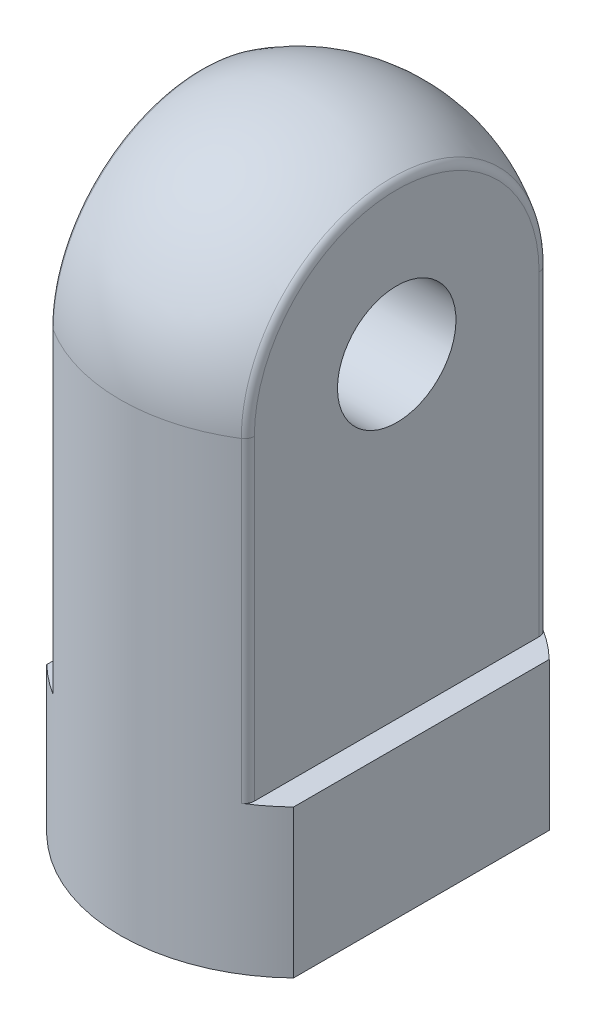
ISO-10303-21;
HEADER;
FILE_DESCRIPTION(('STEP AP214'),'2;1');
FILE_NAME('part.step','',(''),(''),'','','');
FILE_SCHEMA(('AUTOMOTIVE_DESIGN { 1 0 10303 214 1 1 1 1 }'));
ENDSEC;
DATA;
#1=APPLICATION_CONTEXT('core data for automotive mechanical design processes');
#2=APPLICATION_PROTOCOL_DEFINITION('international standard','automotive_design',2000,#1);
#3=PRODUCT_CONTEXT('',#1,'mechanical');
#4=PRODUCT('Part','Part','',(#3));
#5=PRODUCT_RELATED_PRODUCT_CATEGORY('part','',(#4));
#6=PRODUCT_DEFINITION_FORMATION('','',#4);
#7=PRODUCT_DEFINITION_CONTEXT('part definition',#1,'design');
#8=PRODUCT_DEFINITION('design','',#6,#7);
#9=PRODUCT_DEFINITION_SHAPE('','',#8);
#10=(LENGTH_UNIT() NAMED_UNIT(*) SI_UNIT(.MILLI.,.METRE.));
#11=(NAMED_UNIT(*) PLANE_ANGLE_UNIT() SI_UNIT($,.RADIAN.));
#12=(NAMED_UNIT(*) SI_UNIT($,.STERADIAN.) SOLID_ANGLE_UNIT());
#13=UNCERTAINTY_MEASURE_WITH_UNIT(LENGTH_MEASURE(1.E-05),#10,'distance_accuracy_value','');
#14=(GEOMETRIC_REPRESENTATION_CONTEXT(3) GLOBAL_UNCERTAINTY_ASSIGNED_CONTEXT((#13)) GLOBAL_UNIT_ASSIGNED_CONTEXT((#10,
#11,#12)) REPRESENTATION_CONTEXT('',''));
#15=CARTESIAN_POINT('',(0.,0.,0.));
#16=DIRECTION('',(0.,0.,1.));
#17=DIRECTION('',(1.,0.,0.));
#18=AXIS2_PLACEMENT_3D('',#15,#16,#17);
#19=CARTESIAN_POINT('',(0.,65.,0.));
#20=DIRECTION('',(0.,-1.,0.));
#21=DIRECTION('',(0.,0.,-1.));
#22=AXIS2_PLACEMENT_3D('',#19,#20,#21);
#23=CYLINDRICAL_SURFACE('',#22,18.);
#24=CARTESIAN_POINT('',(0.,47.,0.));
#25=DIRECTION('',(0.,-1.,0.));
#26=DIRECTION('',(0.,0.,-1.));
#27=AXIS2_PLACEMENT_3D('',#24,#25,#26);
#28=CIRCLE('',#27,18.);
#29=CARTESIAN_POINT('',(-9.52941176470586,47.,-15.2705701078475));
#30=VERTEX_POINT('',#29);
#31=CARTESIAN_POINT('',(9.52941176470587,47.,-15.2705701078475));
#32=VERTEX_POINT('',#31);
#33=EDGE_CURVE('E179',#30,#32,#28,.T.);
#34=ORIENTED_EDGE('',*,*,#33,.T.);
#35=DIRECTION('',(0.,-1.,0.));
#36=VECTOR('',#35,1.);
#37=CARTESIAN_POINT('',(9.52941176470587,65.,-15.2705701078475));
#38=LINE('',#37,#36);
#39=CARTESIAN_POINT('',(9.52941176470587,15.,-15.2705701078475));
#40=VERTEX_POINT('',#39);
#41=EDGE_CURVE('E208',#32,#40,#38,.T.);
#42=ORIENTED_EDGE('',*,*,#41,.T.);
#43=CARTESIAN_POINT('',(0.,15.,0.));
#44=DIRECTION('',(0.,1.,0.));
#45=DIRECTION('',(-1.,0.,0.));
#46=AXIS2_PLACEMENT_3D('',#43,#44,#45);
#47=CIRCLE('',#46,18.);
#48=CARTESIAN_POINT('',(12.5,15.,-12.9518338469886));
#49=VERTEX_POINT('',#48);
#50=EDGE_CURVE('E188',#49,#40,#47,.T.);
#51=ORIENTED_EDGE('',*,*,#50,.F.);
#52=DIRECTION('',(0.,-1.,0.));
#53=VECTOR('',#52,1.);
#54=CARTESIAN_POINT('',(12.5,65.,-12.9518338469886));
#55=LINE('',#54,#53);
#56=CARTESIAN_POINT('',(12.5,0.,-12.9518338469886));
#57=VERTEX_POINT('',#56);
#58=EDGE_CURVE('E159',#57,#49,#55,.F.);
#59=ORIENTED_EDGE('',*,*,#58,.F.);
#60=CARTESIAN_POINT('',(0.,0.,0.));
#61=DIRECTION('',(0.,1.,0.));
#62=DIRECTION('',(0.,0.,1.));
#63=AXIS2_PLACEMENT_3D('',#60,#61,#62);
#64=CIRCLE('',#63,18.);
#65=CARTESIAN_POINT('',(-12.5,0.,-12.9518338469886));
#66=VERTEX_POINT('',#65);
#67=EDGE_CURVE('E175',#57,#66,#64,.T.);
#68=ORIENTED_EDGE('',*,*,#67,.T.);
#69=DIRECTION('',(0.,-1.,0.));
#70=VECTOR('',#69,1.);
#71=CARTESIAN_POINT('',(-12.5,65.,-12.9518338469886));
#72=LINE('',#71,#70);
#73=CARTESIAN_POINT('',(-12.5,15.,-12.9518338469886));
#74=VERTEX_POINT('',#73);
#75=EDGE_CURVE('E172',#74,#66,#72,.T.);
#76=ORIENTED_EDGE('',*,*,#75,.F.);
#77=CARTESIAN_POINT('',(0.,15.,0.));
#78=DIRECTION('',(0.,1.,0.));
#79=DIRECTION('',(0.,0.,1.));
#80=AXIS2_PLACEMENT_3D('',#77,#78,#79);
#81=CIRCLE('',#80,18.);
#82=CARTESIAN_POINT('',(-9.52941176470586,15.,-15.2705701078475));
#83=VERTEX_POINT('',#82);
#84=EDGE_CURVE('E193',#83,#74,#81,.T.);
#85=ORIENTED_EDGE('',*,*,#84,.F.);
#86=DIRECTION('',(0.,-1.,0.));
#87=VECTOR('',#86,1.);
#88=CARTESIAN_POINT('',(-9.52941176470586,65.,-15.2705701078475));
#89=LINE('',#88,#87);
#90=EDGE_CURVE('E206',#83,#30,#89,.F.);
#91=ORIENTED_EDGE('',*,*,#90,.T.);
#92=EDGE_LOOP('',(#34,#42,#51,#59,#68,#76,#85,#91));
#93=FACE_BOUND('',#92,.T.);
#94=ADVANCED_FACE('F41',(#93),#23,.T.);
#95=CARTESIAN_POINT('',(9.52941176470587,15.,15.2705701078475));
#96=VERTEX_POINT('',#95);
#97=CARTESIAN_POINT('',(12.5,15.,12.9518338469886));
#98=VERTEX_POINT('',#97);
#99=EDGE_CURVE('E190',#96,#98,#47,.T.);
#100=ORIENTED_EDGE('',*,*,#99,.F.);
#101=DIRECTION('',(0.,-1.,0.));
#102=VECTOR('',#101,1.);
#103=CARTESIAN_POINT('',(9.52941176470587,65.,15.2705701078475));
#104=LINE('',#103,#102);
#105=CARTESIAN_POINT('',(9.52941176470587,47.,15.2705701078475));
#106=VERTEX_POINT('',#105);
#107=EDGE_CURVE('E204',#96,#106,#104,.F.);
#108=ORIENTED_EDGE('',*,*,#107,.T.);
#109=CARTESIAN_POINT('',(-9.52941176470586,47.,15.2705701078475));
#110=VERTEX_POINT('',#109);
#111=EDGE_CURVE('E182',#106,#110,#28,.T.);
#112=ORIENTED_EDGE('',*,*,#111,.T.);
#113=DIRECTION('',(0.,-1.,0.));
#114=VECTOR('',#113,1.);
#115=CARTESIAN_POINT('',(-9.52941176470586,65.,15.2705701078475));
#116=LINE('',#115,#114);
#117=CARTESIAN_POINT('',(-9.52941176470586,15.,15.2705701078475));
#118=VERTEX_POINT('',#117);
#119=EDGE_CURVE('E201',#110,#118,#116,.T.);
#120=ORIENTED_EDGE('',*,*,#119,.T.);
#121=CARTESIAN_POINT('',(-12.5,15.,12.9518338469886));
#122=VERTEX_POINT('',#121);
#123=EDGE_CURVE('E191',#122,#118,#81,.T.);
#124=ORIENTED_EDGE('',*,*,#123,.F.);
#125=DIRECTION('',(0.,-1.,0.));
#126=VECTOR('',#125,1.);
#127=CARTESIAN_POINT('',(-12.5,65.,12.9518338469886));
#128=LINE('',#127,#126);
#129=CARTESIAN_POINT('',(-12.5,0.,12.9518338469886));
#130=VERTEX_POINT('',#129);
#131=EDGE_CURVE('E170',#130,#122,#128,.F.);
#132=ORIENTED_EDGE('',*,*,#131,.F.);
#133=CARTESIAN_POINT('',(12.5,0.,12.9518338469886));
#134=VERTEX_POINT('',#133);
#135=EDGE_CURVE('E176',#130,#134,#64,.T.);
#136=ORIENTED_EDGE('',*,*,#135,.T.);
#137=DIRECTION('',(0.,-1.,0.));
#138=VECTOR('',#137,1.);
#139=CARTESIAN_POINT('',(12.5,65.,12.9518338469886));
#140=LINE('',#139,#138);
#141=EDGE_CURVE('E168',#98,#134,#140,.T.);
#142=ORIENTED_EDGE('',*,*,#141,.F.);
#143=EDGE_LOOP('',(#100,#108,#112,#120,#124,#132,#136,#142));
#144=FACE_BOUND('',#143,.T.);
#145=ADVANCED_FACE('F245',(#144),#23,.T.);
#146=CARTESIAN_POINT('',(0.,0.,0.));
#147=DIRECTION('',(0.,1.,0.));
#148=DIRECTION('',(0.,0.,1.));
#149=AXIS2_PLACEMENT_3D('',#146,#147,#148);
#150=PLANE('',#149);
#151=CARTESIAN_POINT('',(0.,0.,0.));
#152=DIRECTION('',(0.,-1.,0.));
#153=DIRECTION('',(0.,0.,-1.));
#154=AXIS2_PLACEMENT_3D('',#151,#152,#153);
#155=CIRCLE('',#154,5.1);
#156=CARTESIAN_POINT('',(0.,0.,-5.1));
#157=VERTEX_POINT('',#156);
#158=EDGE_CURVE('E144',#157,#157,#155,.T.);
#159=ORIENTED_EDGE('',*,*,#158,.F.);
#160=EDGE_LOOP('',(#159));
#161=FACE_BOUND('',#160,.T.);
#162=DIRECTION('',(0.,0.,1.));
#163=VECTOR('',#162,1.);
#164=CARTESIAN_POINT('',(-12.5,0.,0.));
#165=LINE('',#164,#163);
#166=EDGE_CURVE('E185',#66,#130,#165,.T.);
#167=ORIENTED_EDGE('',*,*,#166,.F.);
#168=ORIENTED_EDGE('',*,*,#67,.F.);
#169=DIRECTION('',(0.,0.,-1.));
#170=VECTOR('',#169,1.);
#171=CARTESIAN_POINT('',(12.5,0.,0.));
#172=LINE('',#171,#170);
#173=EDGE_CURVE('E183',#134,#57,#172,.T.);
#174=ORIENTED_EDGE('',*,*,#173,.F.);
#175=ORIENTED_EDGE('',*,*,#135,.F.);
#176=EDGE_LOOP('',(#167,#168,#174,#175));
#177=FACE_BOUND('',#176,.T.);
#178=ADVANCED_FACE('F288',(#161,#177),#150,.F.);
#179=CARTESIAN_POINT('',(0.,47.,0.));
#180=DIRECTION('',(0.,0.,1.));
#181=DIRECTION('',(1.,0.,0.));
#182=AXIS2_PLACEMENT_3D('',#179,#180,#181);
#183=SPHERICAL_SURFACE('',#182,18.);
#184=ORIENTED_EDGE('',*,*,#111,.F.);
#185=CARTESIAN_POINT('',(9.52941176470587,47.,0.));
#186=DIRECTION('',(-1.,0.,0.));
#187=DIRECTION('',(0.,-1.,0.));
#188=AXIS2_PLACEMENT_3D('',#185,#186,#187);
#189=CIRCLE('',#188,15.2705701078475);
#190=EDGE_CURVE('E217',#106,#32,#189,.T.);
#191=ORIENTED_EDGE('',*,*,#190,.T.);
#192=ORIENTED_EDGE('',*,*,#33,.F.);
#193=CARTESIAN_POINT('',(-9.52941176470586,47.,0.));
#194=DIRECTION('',(1.,0.,0.));
#195=DIRECTION('',(0.,0.,-1.));
#196=AXIS2_PLACEMENT_3D('',#193,#194,#195);
#197=CIRCLE('',#196,15.2705701078475);
#198=EDGE_CURVE('E215',#30,#110,#197,.T.);
#199=ORIENTED_EDGE('',*,*,#198,.T.);
#200=EDGE_LOOP('',(#184,#191,#192,#199));
#201=FACE_BOUND('',#200,.T.);
#202=ADVANCED_FACE('F251',(#201),#183,.T.);
#203=CARTESIAN_POINT('',(12.5,0.,-18.));
#204=DIRECTION('',(1.,0.,0.));
#205=DIRECTION('',(0.,1.,0.));
#206=AXIS2_PLACEMENT_3D('',#203,#204,#205);
#207=PLANE('',#206);
#208=ORIENTED_EDGE('',*,*,#141,.T.);
#209=ORIENTED_EDGE('',*,*,#173,.T.);
#210=ORIENTED_EDGE('',*,*,#58,.T.);
#211=DIRECTION('',(0.,0.,1.));
#212=VECTOR('',#211,1.);
#213=CARTESIAN_POINT('',(12.5,15.,-18.));
#214=LINE('',#213,#212);
#215=EDGE_CURVE('E155',#49,#98,#214,.T.);
#216=ORIENTED_EDGE('',*,*,#215,.T.);
#217=EDGE_LOOP('',(#208,#209,#210,#216));
#218=FACE_BOUND('',#217,.T.);
#219=ADVANCED_FACE('F291',(#218),#207,.T.);
#220=CARTESIAN_POINT('',(10.,15.,-18.));
#221=DIRECTION('',(1.,0.,0.));
#222=DIRECTION('',(0.,1.,0.));
#223=AXIS2_PLACEMENT_3D('',#220,#221,#222);
#224=PLANE('',#223);
#225=CARTESIAN_POINT('',(9.99999999999999,47.,0.));
#226=DIRECTION('',(1.,0.,0.));
#227=DIRECTION('',(0.,1.,0.));
#228=AXIS2_PLACEMENT_3D('',#225,#226,#227);
#229=CIRCLE('',#228,6.);
#230=CARTESIAN_POINT('',(9.99999999999999,53.,0.));
#231=VERTEX_POINT('',#230);
#232=EDGE_CURVE('E147',#231,#231,#229,.T.);
#233=ORIENTED_EDGE('',*,*,#232,.F.);
#234=EDGE_LOOP('',(#233));
#235=FACE_BOUND('',#234,.T.);
#236=CARTESIAN_POINT('',(9.99999999999999,47.,0.));
#237=DIRECTION('',(1.,0.,0.));
#238=DIRECTION('',(0.,1.,0.));
#239=AXIS2_PLACEMENT_3D('',#236,#237,#238);
#240=CIRCLE('',#239,14.422205101856);
#241=CARTESIAN_POINT('',(9.99999999999999,47.,-14.422205101856));
#242=VERTEX_POINT('',#241);
#243=CARTESIAN_POINT('',(9.99999999999999,47.,14.422205101856));
#244=VERTEX_POINT('',#243);
#245=EDGE_CURVE('E194',#242,#244,#240,.T.);
#246=ORIENTED_EDGE('',*,*,#245,.T.);
#247=DIRECTION('',(0.,1.,0.));
#248=VECTOR('',#247,1.);
#249=CARTESIAN_POINT('',(10.,15.,14.422205101856));
#250=LINE('',#249,#248);
#251=CARTESIAN_POINT('',(10.,15.,14.422205101856));
#252=VERTEX_POINT('',#251);
#253=EDGE_CURVE('E198',#244,#252,#250,.F.);
#254=ORIENTED_EDGE('',*,*,#253,.T.);
#255=DIRECTION('',(0.,0.,1.));
#256=VECTOR('',#255,1.);
#257=CARTESIAN_POINT('',(10.,15.,-18.));
#258=LINE('',#257,#256);
#259=CARTESIAN_POINT('',(10.,15.,-14.422205101856));
#260=VERTEX_POINT('',#259);
#261=EDGE_CURVE('E162',#260,#252,#258,.T.);
#262=ORIENTED_EDGE('',*,*,#261,.F.);
#263=DIRECTION('',(0.,1.,0.));
#264=VECTOR('',#263,1.);
#265=CARTESIAN_POINT('',(9.99999999999999,47.,-14.422205101856));
#266=LINE('',#265,#264);
#267=EDGE_CURVE('E196',#260,#242,#266,.T.);
#268=ORIENTED_EDGE('',*,*,#267,.T.);
#269=EDGE_LOOP('',(#246,#254,#262,#268));
#270=FACE_BOUND('',#269,.T.);
#271=ADVANCED_FACE('F263',(#235,#270),#224,.T.);
#272=CARTESIAN_POINT('',(12.5,15.,-18.));
#273=DIRECTION('',(0.,1.,0.));
#274=DIRECTION('',(-1.,0.,0.));
#275=AXIS2_PLACEMENT_3D('',#272,#273,#274);
#276=PLANE('',#275);
#277=ORIENTED_EDGE('',*,*,#99,.T.);
#278=ORIENTED_EDGE('',*,*,#215,.F.);
#279=ORIENTED_EDGE('',*,*,#50,.T.);
#280=CARTESIAN_POINT('',(8.99999999999999,15.,-14.422205101856));
#281=DIRECTION('',(0.,1.,0.));
#282=DIRECTION('',(-1.,0.,0.));
#283=AXIS2_PLACEMENT_3D('',#280,#281,#282);
#284=CIRCLE('',#283,1.);
#285=EDGE_CURVE('E222',#40,#260,#284,.F.);
#286=ORIENTED_EDGE('',*,*,#285,.T.);
#287=ORIENTED_EDGE('',*,*,#261,.T.);
#288=CARTESIAN_POINT('',(8.99999999999999,15.,14.422205101856));
#289=DIRECTION('',(0.,1.,0.));
#290=DIRECTION('',(-1.,0.,0.));
#291=AXIS2_PLACEMENT_3D('',#288,#289,#290);
#292=CIRCLE('',#291,1.);
#293=EDGE_CURVE('E219',#252,#96,#292,.F.);
#294=ORIENTED_EDGE('',*,*,#293,.T.);
#295=EDGE_LOOP('',(#277,#278,#279,#286,#287,#294));
#296=FACE_BOUND('',#295,.T.);
#297=ADVANCED_FACE('F266',(#296),#276,.T.);
#298=CARTESIAN_POINT('',(-12.5,15.,-18.));
#299=DIRECTION('',(0.,1.,0.));
#300=DIRECTION('',(0.,0.,1.));
#301=AXIS2_PLACEMENT_3D('',#298,#299,#300);
#302=PLANE('',#301);
#303=ORIENTED_EDGE('',*,*,#84,.T.);
#304=DIRECTION('',(0.,0.,1.));
#305=VECTOR('',#304,1.);
#306=CARTESIAN_POINT('',(-12.5,15.,-18.));
#307=LINE('',#306,#305);
#308=EDGE_CURVE('E156',#74,#122,#307,.T.);
#309=ORIENTED_EDGE('',*,*,#308,.T.);
#310=ORIENTED_EDGE('',*,*,#123,.T.);
#311=CARTESIAN_POINT('',(-8.99999999999998,15.,14.422205101856));
#312=DIRECTION('',(0.,1.,0.));
#313=DIRECTION('',(0.,0.,1.));
#314=AXIS2_PLACEMENT_3D('',#311,#312,#313);
#315=CIRCLE('',#314,1.);
#316=CARTESIAN_POINT('',(-9.99999999999998,15.,14.422205101856));
#317=VERTEX_POINT('',#316);
#318=EDGE_CURVE('E12',#118,#317,#315,.F.);
#319=ORIENTED_EDGE('',*,*,#318,.T.);
#320=DIRECTION('',(0.,0.,1.));
#321=VECTOR('',#320,1.);
#322=CARTESIAN_POINT('',(-9.99999999999998,15.,-18.));
#323=LINE('',#322,#321);
#324=CARTESIAN_POINT('',(-9.99999999999998,15.,-14.422205101856));
#325=VERTEX_POINT('',#324);
#326=EDGE_CURVE('E160',#325,#317,#323,.T.);
#327=ORIENTED_EDGE('',*,*,#326,.F.);
#328=CARTESIAN_POINT('',(-8.99999999999998,15.,-14.422205101856));
#329=DIRECTION('',(0.,1.,0.));
#330=DIRECTION('',(0.,0.,1.));
#331=AXIS2_PLACEMENT_3D('',#328,#329,#330);
#332=CIRCLE('',#331,1.);
#333=EDGE_CURVE('E50',#325,#83,#332,.F.);
#334=ORIENTED_EDGE('',*,*,#333,.T.);
#335=EDGE_LOOP('',(#303,#309,#310,#319,#327,#334));
#336=FACE_BOUND('',#335,.T.);
#337=ADVANCED_FACE('F280',(#336),#302,.T.);
#338=CARTESIAN_POINT('',(-12.5,0.,-18.));
#339=DIRECTION('',(-1.,0.,0.));
#340=DIRECTION('',(0.,0.,1.));
#341=AXIS2_PLACEMENT_3D('',#338,#339,#340);
#342=PLANE('',#341);
#343=ORIENTED_EDGE('',*,*,#75,.T.);
#344=ORIENTED_EDGE('',*,*,#166,.T.);
#345=ORIENTED_EDGE('',*,*,#131,.T.);
#346=ORIENTED_EDGE('',*,*,#308,.F.);
#347=EDGE_LOOP('',(#343,#344,#345,#346));
#348=FACE_BOUND('',#347,.T.);
#349=ADVANCED_FACE('F283',(#348),#342,.T.);
#350=CARTESIAN_POINT('',(-9.99999999999998,15.,-18.));
#351=DIRECTION('',(-1.,0.,0.));
#352=DIRECTION('',(0.,0.,1.));
#353=AXIS2_PLACEMENT_3D('',#350,#351,#352);
#354=PLANE('',#353);
#355=CARTESIAN_POINT('',(-9.99999999999998,47.,0.));
#356=DIRECTION('',(-1.,0.,0.));
#357=DIRECTION('',(0.,0.,1.));
#358=AXIS2_PLACEMENT_3D('',#355,#356,#357);
#359=CIRCLE('',#358,6.);
#360=CARTESIAN_POINT('',(-9.99999999999998,47.,6.));
#361=VERTEX_POINT('',#360);
#362=EDGE_CURVE('E143',#361,#361,#359,.T.);
#363=ORIENTED_EDGE('',*,*,#362,.F.);
#364=EDGE_LOOP('',(#363));
#365=FACE_BOUND('',#364,.T.);
#366=CARTESIAN_POINT('',(-9.99999999999998,47.,0.));
#367=DIRECTION('',(-1.,0.,0.));
#368=DIRECTION('',(0.,0.,1.));
#369=AXIS2_PLACEMENT_3D('',#366,#367,#368);
#370=CIRCLE('',#369,14.422205101856);
#371=CARTESIAN_POINT('',(-9.99999999999998,47.,14.422205101856));
#372=VERTEX_POINT('',#371);
#373=CARTESIAN_POINT('',(-9.99999999999998,47.,-14.422205101856));
#374=VERTEX_POINT('',#373);
#375=EDGE_CURVE('E58',#372,#374,#370,.T.);
#376=ORIENTED_EDGE('',*,*,#375,.T.);
#377=DIRECTION('',(0.,1.,0.));
#378=VECTOR('',#377,1.);
#379=CARTESIAN_POINT('',(-9.99999999999998,15.,-14.422205101856));
#380=LINE('',#379,#378);
#381=EDGE_CURVE('E213',#374,#325,#380,.F.);
#382=ORIENTED_EDGE('',*,*,#381,.T.);
#383=ORIENTED_EDGE('',*,*,#326,.T.);
#384=DIRECTION('',(0.,1.,0.));
#385=VECTOR('',#384,1.);
#386=CARTESIAN_POINT('',(-9.99999999999998,47.,14.422205101856));
#387=LINE('',#386,#385);
#388=EDGE_CURVE('E63',#317,#372,#387,.T.);
#389=ORIENTED_EDGE('',*,*,#388,.T.);
#390=EDGE_LOOP('',(#376,#382,#383,#389));
#391=FACE_BOUND('',#390,.T.);
#392=ADVANCED_FACE('F279',(#365,#391),#354,.T.);
#393=CARTESIAN_POINT('',(70.,47.,0.));
#394=DIRECTION('',(-1.,0.,0.));
#395=DIRECTION('',(0.,0.,1.));
#396=AXIS2_PLACEMENT_3D('',#393,#394,#395);
#397=CYLINDRICAL_SURFACE('',#396,6.);
#398=ORIENTED_EDGE('',*,*,#232,.T.);
#399=EDGE_LOOP('',(#398));
#400=FACE_BOUND('',#399,.T.);
#401=ORIENTED_EDGE('',*,*,#362,.T.);
#402=EDGE_LOOP('',(#401));
#403=FACE_BOUND('',#402,.T.);
#404=ADVANCED_FACE('F137',(#400,#403),#397,.F.);
#405=CARTESIAN_POINT('',(0.,32.75,0.));
#406=DIRECTION('',(0.,-1.,0.));
#407=DIRECTION('',(0.,0.,-1.));
#408=AXIS2_PLACEMENT_3D('',#405,#406,#407);
#409=CONICAL_SURFACE('',#408,5.09999999999999,1.02974425867665);
#410=CARTESIAN_POINT('',(0.,35.8143891570406,0.));
#411=VERTEX_POINT('',#410);
#412=VERTEX_LOOP('',#411);
#413=FACE_BOUND('',#412,.T.);
#414=CARTESIAN_POINT('',(0.,32.75,0.));
#415=DIRECTION('',(0.,-1.,0.));
#416=DIRECTION('',(0.,0.,-1.));
#417=AXIS2_PLACEMENT_3D('',#414,#415,#416);
#418=CIRCLE('',#417,5.09999999999999);
#419=CARTESIAN_POINT('',(0.,32.75,-5.09999999999999));
#420=VERTEX_POINT('',#419);
#421=EDGE_CURVE('E141',#420,#420,#418,.T.);
#422=ORIENTED_EDGE('',*,*,#421,.T.);
#423=EDGE_LOOP('',(#422));
#424=FACE_BOUND('',#423,.T.);
#425=ADVANCED_FACE('F133',(#413,#424),#409,.F.);
#426=CARTESIAN_POINT('',(0.,0.,0.));
#427=DIRECTION('',(0.,-1.,0.));
#428=DIRECTION('',(0.,0.,-1.));
#429=AXIS2_PLACEMENT_3D('',#426,#427,#428);
#430=CYLINDRICAL_SURFACE('',#429,5.1);
#431=ORIENTED_EDGE('',*,*,#421,.F.);
#432=EDGE_LOOP('',(#431));
#433=FACE_BOUND('',#432,.T.);
#434=ORIENTED_EDGE('',*,*,#158,.T.);
#435=EDGE_LOOP('',(#434));
#436=FACE_BOUND('',#435,.T.);
#437=ADVANCED_FACE('F136',(#433,#436),#430,.F.);
#438=CARTESIAN_POINT('',(8.99999999999999,65.,-14.422205101856));
#439=DIRECTION('',(0.,-1.,0.));
#440=DIRECTION('',(0.,0.,-1.));
#441=AXIS2_PLACEMENT_3D('',#438,#439,#440);
#442=CYLINDRICAL_SURFACE('',#441,1.);
#443=ORIENTED_EDGE('',*,*,#285,.F.);
#444=ORIENTED_EDGE('',*,*,#41,.F.);
#445=CARTESIAN_POINT('',(8.99999999999999,47.,-14.422205101856));
#446=DIRECTION('',(0.,1.,0.));
#447=DIRECTION('',(0.,0.,1.));
#448=AXIS2_PLACEMENT_3D('',#445,#446,#447);
#449=CIRCLE('',#448,1.);
#450=EDGE_CURVE('E150',#242,#32,#449,.T.);
#451=ORIENTED_EDGE('',*,*,#450,.F.);
#452=ORIENTED_EDGE('',*,*,#267,.F.);
#453=EDGE_LOOP('',(#443,#444,#451,#452));
#454=FACE_BOUND('',#453,.T.);
#455=ADVANCED_FACE('F272',(#454),#442,.T.);
#456=CARTESIAN_POINT('',(8.99999999999999,47.,0.));
#457=DIRECTION('',(1.,0.,0.));
#458=DIRECTION('',(0.,1.,0.));
#459=AXIS2_PLACEMENT_3D('',#456,#457,#458);
#460=TOROIDAL_SURFACE('',#459,14.422205101856,1.);
#461=ORIENTED_EDGE('',*,*,#450,.T.);
#462=ORIENTED_EDGE('',*,*,#190,.F.);
#463=CARTESIAN_POINT('',(8.99999999999999,47.,14.422205101856));
#464=DIRECTION('',(0.,-1.,0.));
#465=DIRECTION('',(0.,0.,-1.));
#466=AXIS2_PLACEMENT_3D('',#463,#464,#465);
#467=CIRCLE('',#466,1.);
#468=EDGE_CURVE('E226',#244,#106,#467,.T.);
#469=ORIENTED_EDGE('',*,*,#468,.F.);
#470=ORIENTED_EDGE('',*,*,#245,.F.);
#471=EDGE_LOOP('',(#461,#462,#469,#470));
#472=FACE_BOUND('',#471,.T.);
#473=ADVANCED_FACE('F255',(#472),#460,.T.);
#474=CARTESIAN_POINT('',(8.99999999999999,65.,14.422205101856));
#475=DIRECTION('',(0.,-1.,0.));
#476=DIRECTION('',(0.,0.,-1.));
#477=AXIS2_PLACEMENT_3D('',#474,#475,#476);
#478=CYLINDRICAL_SURFACE('',#477,1.);
#479=ORIENTED_EDGE('',*,*,#468,.T.);
#480=ORIENTED_EDGE('',*,*,#107,.F.);
#481=ORIENTED_EDGE('',*,*,#293,.F.);
#482=ORIENTED_EDGE('',*,*,#253,.F.);
#483=EDGE_LOOP('',(#479,#480,#481,#482));
#484=FACE_BOUND('',#483,.T.);
#485=ADVANCED_FACE('F260',(#484),#478,.T.);
#486=CARTESIAN_POINT('',(-8.99999999999998,65.,14.422205101856));
#487=DIRECTION('',(0.,-1.,0.));
#488=DIRECTION('',(0.,0.,-1.));
#489=AXIS2_PLACEMENT_3D('',#486,#487,#488);
#490=CYLINDRICAL_SURFACE('',#489,1.);
#491=ORIENTED_EDGE('',*,*,#318,.F.);
#492=ORIENTED_EDGE('',*,*,#119,.F.);
#493=CARTESIAN_POINT('',(-8.99999999999998,47.,14.422205101856));
#494=DIRECTION('',(0.,1.,0.));
#495=DIRECTION('',(0.,0.,1.));
#496=AXIS2_PLACEMENT_3D('',#493,#494,#495);
#497=CIRCLE('',#496,1.);
#498=EDGE_CURVE('E45',#372,#110,#497,.T.);
#499=ORIENTED_EDGE('',*,*,#498,.F.);
#500=ORIENTED_EDGE('',*,*,#388,.F.);
#501=EDGE_LOOP('',(#491,#492,#499,#500));
#502=FACE_BOUND('',#501,.T.);
#503=ADVANCED_FACE('F43',(#502),#490,.T.);
#504=CARTESIAN_POINT('',(-8.99999999999998,47.,0.));
#505=DIRECTION('',(-1.,0.,0.));
#506=DIRECTION('',(0.,0.,1.));
#507=AXIS2_PLACEMENT_3D('',#504,#505,#506);
#508=TOROIDAL_SURFACE('',#507,14.422205101856,1.);
#509=ORIENTED_EDGE('',*,*,#498,.T.);
#510=ORIENTED_EDGE('',*,*,#198,.F.);
#511=CARTESIAN_POINT('',(-8.99999999999998,47.,-14.422205101856));
#512=DIRECTION('',(0.,-1.,0.));
#513=DIRECTION('',(0.,0.,-1.));
#514=AXIS2_PLACEMENT_3D('',#511,#512,#513);
#515=CIRCLE('',#514,1.);
#516=EDGE_CURVE('E230',#374,#30,#515,.T.);
#517=ORIENTED_EDGE('',*,*,#516,.F.);
#518=ORIENTED_EDGE('',*,*,#375,.F.);
#519=EDGE_LOOP('',(#509,#510,#517,#518));
#520=FACE_BOUND('',#519,.T.);
#521=ADVANCED_FACE('F238',(#520),#508,.T.);
#522=CARTESIAN_POINT('',(-8.99999999999998,65.,-14.422205101856));
#523=DIRECTION('',(0.,-1.,0.));
#524=DIRECTION('',(0.,0.,-1.));
#525=AXIS2_PLACEMENT_3D('',#522,#523,#524);
#526=CYLINDRICAL_SURFACE('',#525,1.);
#527=ORIENTED_EDGE('',*,*,#516,.T.);
#528=ORIENTED_EDGE('',*,*,#90,.F.);
#529=ORIENTED_EDGE('',*,*,#333,.F.);
#530=ORIENTED_EDGE('',*,*,#381,.F.);
#531=EDGE_LOOP('',(#527,#528,#529,#530));
#532=FACE_BOUND('',#531,.T.);
#533=ADVANCED_FACE('F276',(#532),#526,.T.);
#534=CLOSED_SHELL('',(#94,#145,#178,#202,#219,#271,#297,#337,#349,#392,#404,#425,#437,#455,#473,
#485,#503,#521,#533));
#535=MANIFOLD_SOLID_BREP('B2',#534);
#536=ADVANCED_BREP_SHAPE_REPRESENTATION('',(#18,#535),#14);
#537=SHAPE_DEFINITION_REPRESENTATION(#9,#536);
ENDSEC;
END-ISO-10303-21;
